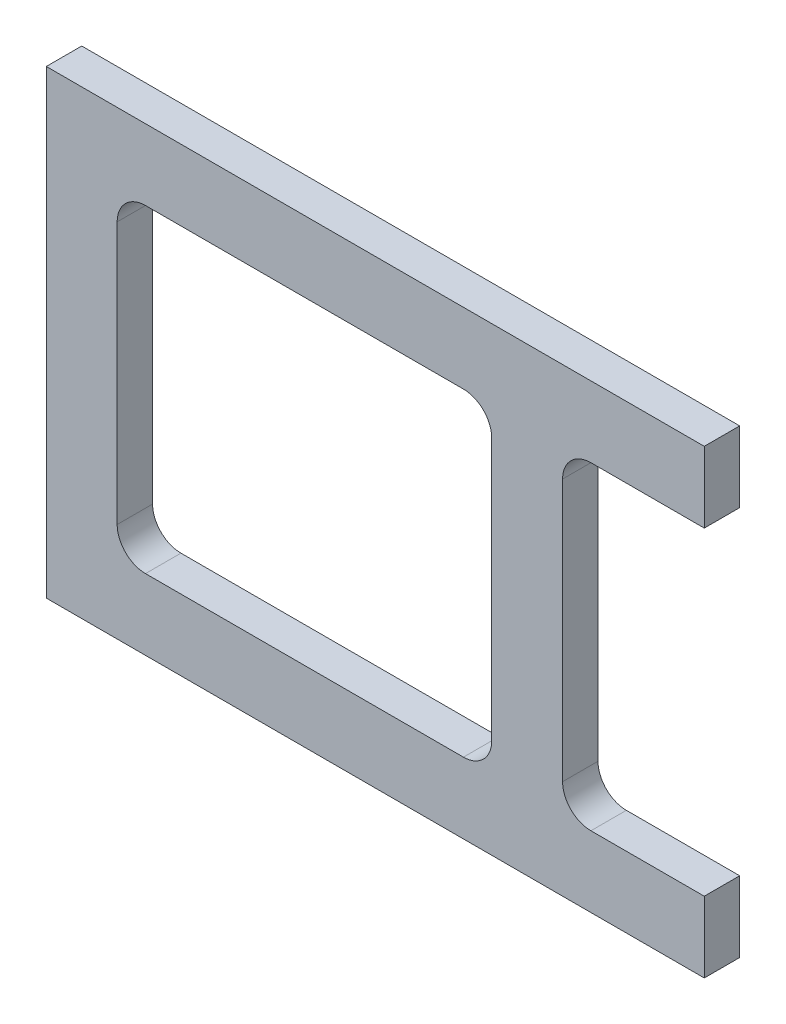
ISO-10303-21;
HEADER;
FILE_DESCRIPTION(('STEP AP214'),'2;1');
FILE_NAME('part.step','',(''),(''),'','','');
FILE_SCHEMA(('AUTOMOTIVE_DESIGN { 1 0 10303 214 1 1 1 1 }'));
ENDSEC;
DATA;
#1=APPLICATION_CONTEXT('core data for automotive mechanical design processes');
#2=APPLICATION_PROTOCOL_DEFINITION('international standard','automotive_design',2000,#1);
#3=PRODUCT_CONTEXT('',#1,'mechanical');
#4=PRODUCT('Part','Part','',(#3));
#5=PRODUCT_RELATED_PRODUCT_CATEGORY('part','',(#4));
#6=PRODUCT_DEFINITION_FORMATION('','',#4);
#7=PRODUCT_DEFINITION_CONTEXT('part definition',#1,'design');
#8=PRODUCT_DEFINITION('design','',#6,#7);
#9=PRODUCT_DEFINITION_SHAPE('','',#8);
#10=(LENGTH_UNIT() NAMED_UNIT(*) SI_UNIT(.MILLI.,.METRE.));
#11=(NAMED_UNIT(*) PLANE_ANGLE_UNIT() SI_UNIT($,.RADIAN.));
#12=(NAMED_UNIT(*) SI_UNIT($,.STERADIAN.) SOLID_ANGLE_UNIT());
#13=UNCERTAINTY_MEASURE_WITH_UNIT(LENGTH_MEASURE(1.E-05),#10,'distance_accuracy_value','');
#14=(GEOMETRIC_REPRESENTATION_CONTEXT(3) GLOBAL_UNCERTAINTY_ASSIGNED_CONTEXT((#13)) GLOBAL_UNIT_ASSIGNED_CONTEXT((#10,
#11,#12)) REPRESENTATION_CONTEXT('',''));
#15=CARTESIAN_POINT('',(0.,0.,0.));
#16=DIRECTION('',(0.,0.,1.));
#17=DIRECTION('',(1.,0.,0.));
#18=AXIS2_PLACEMENT_3D('',#15,#16,#17);
#19=CARTESIAN_POINT('',(29.4894,-20.6375,3.175));
#20=DIRECTION('',(-1.,0.,0.));
#21=DIRECTION('',(0.,0.,1.));
#22=AXIS2_PLACEMENT_3D('',#19,#20,#21);
#23=PLANE('',#22);
#24=DIRECTION('',(0.,1.,0.));
#25=VECTOR('',#24,1.);
#26=CARTESIAN_POINT('',(29.4894,-20.6375,0.));
#27=LINE('',#26,#25);
#28=CARTESIAN_POINT('',(29.4894,-20.6375,0.));
#29=VERTEX_POINT('',#28);
#30=CARTESIAN_POINT('',(29.4894,-14.2875,0.));
#31=VERTEX_POINT('',#30);
#32=EDGE_CURVE('E178',#29,#31,#27,.T.);
#33=ORIENTED_EDGE('',*,*,#32,.T.);
#34=DIRECTION('',(0.,0.,1.));
#35=VECTOR('',#34,1.);
#36=CARTESIAN_POINT('',(29.4894,-14.2875,0.));
#37=LINE('',#36,#35);
#38=CARTESIAN_POINT('',(29.4894,-14.2875,3.175));
#39=VERTEX_POINT('',#38);
#40=EDGE_CURVE('E170',#31,#39,#37,.T.);
#41=ORIENTED_EDGE('',*,*,#40,.T.);
#42=DIRECTION('',(0.,1.,0.));
#43=VECTOR('',#42,1.);
#44=CARTESIAN_POINT('',(29.4894,-20.6375,3.175));
#45=LINE('',#44,#43);
#46=CARTESIAN_POINT('',(29.4894,-20.6375,3.175));
#47=VERTEX_POINT('',#46);
#48=EDGE_CURVE('E277',#47,#39,#45,.T.);
#49=ORIENTED_EDGE('',*,*,#48,.F.);
#50=DIRECTION('',(0.,0.,-1.));
#51=VECTOR('',#50,1.);
#52=CARTESIAN_POINT('',(29.4894,-20.6375,3.175));
#53=LINE('',#52,#51);
#54=EDGE_CURVE('E192',#47,#29,#53,.T.);
#55=ORIENTED_EDGE('',*,*,#54,.T.);
#56=EDGE_LOOP('',(#33,#41,#49,#55));
#57=FACE_BOUND('',#56,.T.);
#58=ADVANCED_FACE('F32',(#57),#23,.F.);
#59=CARTESIAN_POINT('',(29.4894,14.2875,3.175));
#60=VERTEX_POINT('',#59);
#61=CARTESIAN_POINT('',(29.4894,20.6375,3.175));
#62=VERTEX_POINT('',#61);
#63=EDGE_CURVE('E169',#60,#62,#45,.T.);
#64=ORIENTED_EDGE('',*,*,#63,.F.);
#65=DIRECTION('',(0.,0.,1.));
#66=VECTOR('',#65,1.);
#67=CARTESIAN_POINT('',(29.4894,14.2875,0.));
#68=LINE('',#67,#66);
#69=CARTESIAN_POINT('',(29.4894,14.2875,0.));
#70=VERTEX_POINT('',#69);
#71=EDGE_CURVE('E156',#70,#60,#68,.T.);
#72=ORIENTED_EDGE('',*,*,#71,.F.);
#73=CARTESIAN_POINT('',(29.4894,20.6375,0.));
#74=VERTEX_POINT('',#73);
#75=EDGE_CURVE('E167',#70,#74,#27,.T.);
#76=ORIENTED_EDGE('',*,*,#75,.T.);
#77=DIRECTION('',(0.,0.,-1.));
#78=VECTOR('',#77,1.);
#79=CARTESIAN_POINT('',(29.4894,20.6375,3.175));
#80=LINE('',#79,#78);
#81=EDGE_CURVE('E201',#62,#74,#80,.T.);
#82=ORIENTED_EDGE('',*,*,#81,.F.);
#83=EDGE_LOOP('',(#64,#72,#76,#82));
#84=FACE_BOUND('',#83,.T.);
#85=ADVANCED_FACE('F165',(#84),#23,.F.);
#86=CARTESIAN_POINT('',(-29.4894,20.6375,3.175));
#87=DIRECTION('',(0.,-1.,0.));
#88=DIRECTION('',(0.,0.,-1.));
#89=AXIS2_PLACEMENT_3D('',#86,#87,#88);
#90=PLANE('',#89);
#91=DIRECTION('',(-1.,0.,0.));
#92=VECTOR('',#91,1.);
#93=CARTESIAN_POINT('',(-29.4894,20.6375,0.));
#94=LINE('',#93,#92);
#95=CARTESIAN_POINT('',(-29.4894,20.6375,0.));
#96=VERTEX_POINT('',#95);
#97=EDGE_CURVE('E176',#74,#96,#94,.T.);
#98=ORIENTED_EDGE('',*,*,#97,.T.);
#99=DIRECTION('',(0.,0.,-1.));
#100=VECTOR('',#99,1.);
#101=CARTESIAN_POINT('',(-29.4894,20.6375,3.175));
#102=LINE('',#101,#100);
#103=CARTESIAN_POINT('',(-29.4894,20.6375,3.175));
#104=VERTEX_POINT('',#103);
#105=EDGE_CURVE('E198',#104,#96,#102,.T.);
#106=ORIENTED_EDGE('',*,*,#105,.F.);
#107=DIRECTION('',(-1.,0.,0.));
#108=VECTOR('',#107,1.);
#109=CARTESIAN_POINT('',(-29.4894,20.6375,3.175));
#110=LINE('',#109,#108);
#111=EDGE_CURVE('E279',#62,#104,#110,.T.);
#112=ORIENTED_EDGE('',*,*,#111,.F.);
#113=ORIENTED_EDGE('',*,*,#81,.T.);
#114=EDGE_LOOP('',(#98,#106,#112,#113));
#115=FACE_BOUND('',#114,.T.);
#116=ADVANCED_FACE('F295',(#115),#90,.F.);
#117=CARTESIAN_POINT('',(-29.4894,-20.6375,3.175));
#118=DIRECTION('',(1.,0.,0.));
#119=DIRECTION('',(0.,0.,-1.));
#120=AXIS2_PLACEMENT_3D('',#117,#118,#119);
#121=PLANE('',#120);
#122=DIRECTION('',(0.,-1.,0.));
#123=VECTOR('',#122,1.);
#124=CARTESIAN_POINT('',(-29.4894,-20.6375,0.));
#125=LINE('',#124,#123);
#126=CARTESIAN_POINT('',(-29.4894,-20.6375,0.));
#127=VERTEX_POINT('',#126);
#128=EDGE_CURVE('E188',#96,#127,#125,.T.);
#129=ORIENTED_EDGE('',*,*,#128,.T.);
#130=DIRECTION('',(0.,0.,-1.));
#131=VECTOR('',#130,1.);
#132=CARTESIAN_POINT('',(-29.4894,-20.6375,3.175));
#133=LINE('',#132,#131);
#134=CARTESIAN_POINT('',(-29.4894,-20.6375,3.175));
#135=VERTEX_POINT('',#134);
#136=EDGE_CURVE('E195',#135,#127,#133,.T.);
#137=ORIENTED_EDGE('',*,*,#136,.F.);
#138=DIRECTION('',(0.,-1.,0.));
#139=VECTOR('',#138,1.);
#140=CARTESIAN_POINT('',(-29.4894,-20.6375,3.175));
#141=LINE('',#140,#139);
#142=EDGE_CURVE('E280',#104,#135,#141,.T.);
#143=ORIENTED_EDGE('',*,*,#142,.F.);
#144=ORIENTED_EDGE('',*,*,#105,.T.);
#145=EDGE_LOOP('',(#129,#137,#143,#144));
#146=FACE_BOUND('',#145,.T.);
#147=ADVANCED_FACE('F291',(#146),#121,.F.);
#148=CARTESIAN_POINT('',(-29.4894,-20.6375,3.175));
#149=DIRECTION('',(0.,1.,0.));
#150=DIRECTION('',(0.,0.,1.));
#151=AXIS2_PLACEMENT_3D('',#148,#149,#150);
#152=PLANE('',#151);
#153=DIRECTION('',(1.,0.,0.));
#154=VECTOR('',#153,1.);
#155=CARTESIAN_POINT('',(-29.4894,-20.6375,0.));
#156=LINE('',#155,#154);
#157=EDGE_CURVE('E190',#127,#29,#156,.T.);
#158=ORIENTED_EDGE('',*,*,#157,.T.);
#159=ORIENTED_EDGE('',*,*,#54,.F.);
#160=DIRECTION('',(1.,0.,0.));
#161=VECTOR('',#160,1.);
#162=CARTESIAN_POINT('',(-29.4894,-20.6375,3.175));
#163=LINE('',#162,#161);
#164=EDGE_CURVE('E185',#135,#47,#163,.T.);
#165=ORIENTED_EDGE('',*,*,#164,.F.);
#166=ORIENTED_EDGE('',*,*,#136,.T.);
#167=EDGE_LOOP('',(#158,#159,#165,#166));
#168=FACE_BOUND('',#167,.T.);
#169=ADVANCED_FACE('F287',(#168),#152,.F.);
#170=CARTESIAN_POINT('',(0.,0.,3.175));
#171=DIRECTION('',(0.,0.,-1.));
#172=DIRECTION('',(-1.,0.,0.));
#173=AXIS2_PLACEMENT_3D('',#170,#171,#172);
#174=PLANE('',#173);
#175=DIRECTION('',(-1.,0.,0.));
#176=VECTOR('',#175,1.);
#177=CARTESIAN_POINT('',(10.4394,14.2875,3.175));
#178=LINE('',#177,#176);
#179=CARTESIAN_POINT('',(7.89940000000001,14.2875,3.175));
#180=VERTEX_POINT('',#179);
#181=CARTESIAN_POINT('',(-20.5994,14.2875,3.175));
#182=VERTEX_POINT('',#181);
#183=EDGE_CURVE('E306',#180,#182,#178,.T.);
#184=ORIENTED_EDGE('',*,*,#183,.F.);
#185=CARTESIAN_POINT('',(7.89940000000001,11.7475,3.175));
#186=DIRECTION('',(0.,0.,-1.));
#187=DIRECTION('',(-1.,0.,0.));
#188=AXIS2_PLACEMENT_3D('',#185,#186,#187);
#189=CIRCLE('',#188,2.54);
#190=CARTESIAN_POINT('',(10.4394,11.7475,3.175));
#191=VERTEX_POINT('',#190);
#192=EDGE_CURVE('E232',#180,#191,#189,.T.);
#193=ORIENTED_EDGE('',*,*,#192,.T.);
#194=DIRECTION('',(0.,1.,0.));
#195=VECTOR('',#194,1.);
#196=CARTESIAN_POINT('',(10.4394,14.2875,3.175));
#197=LINE('',#196,#195);
#198=CARTESIAN_POINT('',(10.4394,-11.7475,3.175));
#199=VERTEX_POINT('',#198);
#200=EDGE_CURVE('E309',#199,#191,#197,.T.);
#201=ORIENTED_EDGE('',*,*,#200,.F.);
#202=CARTESIAN_POINT('',(7.89940000000001,-11.7475,3.175));
#203=DIRECTION('',(0.,0.,-1.));
#204=DIRECTION('',(-1.,0.,0.));
#205=AXIS2_PLACEMENT_3D('',#202,#203,#204);
#206=CIRCLE('',#205,2.54);
#207=CARTESIAN_POINT('',(7.89940000000001,-14.2875,3.175));
#208=VERTEX_POINT('',#207);
#209=EDGE_CURVE('E236',#199,#208,#206,.T.);
#210=ORIENTED_EDGE('',*,*,#209,.T.);
#211=DIRECTION('',(1.,0.,0.));
#212=VECTOR('',#211,1.);
#213=CARTESIAN_POINT('',(10.4394,-14.2875,3.175));
#214=LINE('',#213,#212);
#215=CARTESIAN_POINT('',(-20.5994,-14.2875,3.175));
#216=VERTEX_POINT('',#215);
#217=EDGE_CURVE('E299',#216,#208,#214,.T.);
#218=ORIENTED_EDGE('',*,*,#217,.F.);
#219=CARTESIAN_POINT('',(-20.5994,-11.7475,3.175));
#220=DIRECTION('',(0.,0.,-1.));
#221=DIRECTION('',(-1.,0.,0.));
#222=AXIS2_PLACEMENT_3D('',#219,#220,#221);
#223=CIRCLE('',#222,2.54);
#224=CARTESIAN_POINT('',(-23.1394,-11.7475,3.175));
#225=VERTEX_POINT('',#224);
#226=EDGE_CURVE('E240',#216,#225,#223,.T.);
#227=ORIENTED_EDGE('',*,*,#226,.T.);
#228=DIRECTION('',(0.,-1.,0.));
#229=VECTOR('',#228,1.);
#230=CARTESIAN_POINT('',(-23.1394,14.2875,3.175));
#231=LINE('',#230,#229);
#232=CARTESIAN_POINT('',(-23.1394,11.7475,3.175));
#233=VERTEX_POINT('',#232);
#234=EDGE_CURVE('E303',#233,#225,#231,.T.);
#235=ORIENTED_EDGE('',*,*,#234,.F.);
#236=CARTESIAN_POINT('',(-20.5994,11.7475,3.175));
#237=DIRECTION('',(0.,0.,-1.));
#238=DIRECTION('',(-1.,0.,0.));
#239=AXIS2_PLACEMENT_3D('',#236,#237,#238);
#240=CIRCLE('',#239,2.54);
#241=EDGE_CURVE('E244',#233,#182,#240,.T.);
#242=ORIENTED_EDGE('',*,*,#241,.T.);
#243=EDGE_LOOP('',(#184,#193,#201,#210,#218,#227,#235,#242));
#244=FACE_BOUND('',#243,.T.);
#245=ORIENTED_EDGE('',*,*,#48,.T.);
#246=DIRECTION('',(1.,0.,0.));
#247=VECTOR('',#246,1.);
#248=CARTESIAN_POINT('',(29.4894,-14.2875,3.175));
#249=LINE('',#248,#247);
#250=CARTESIAN_POINT('',(19.3294,-14.2875,3.175));
#251=VERTEX_POINT('',#250);
#252=EDGE_CURVE('E161',#251,#39,#249,.T.);
#253=ORIENTED_EDGE('',*,*,#252,.F.);
#254=CARTESIAN_POINT('',(19.3294,-11.7475,3.175));
#255=DIRECTION('',(0.,0.,-1.));
#256=DIRECTION('',(-1.,0.,0.));
#257=AXIS2_PLACEMENT_3D('',#254,#255,#256);
#258=CIRCLE('',#257,2.54);
#259=CARTESIAN_POINT('',(16.7894,-11.7475,3.175));
#260=VERTEX_POINT('',#259);
#261=EDGE_CURVE('E248',#251,#260,#258,.T.);
#262=ORIENTED_EDGE('',*,*,#261,.T.);
#263=DIRECTION('',(0.,-1.,0.));
#264=VECTOR('',#263,1.);
#265=CARTESIAN_POINT('',(16.7894,14.2875,3.175));
#266=LINE('',#265,#264);
#267=CARTESIAN_POINT('',(16.7894,11.7475,3.175));
#268=VERTEX_POINT('',#267);
#269=EDGE_CURVE('E267',#268,#260,#266,.T.);
#270=ORIENTED_EDGE('',*,*,#269,.F.);
#271=CARTESIAN_POINT('',(19.3294,11.7475,3.175));
#272=DIRECTION('',(0.,0.,-1.));
#273=DIRECTION('',(-1.,0.,0.));
#274=AXIS2_PLACEMENT_3D('',#271,#272,#273);
#275=CIRCLE('',#274,2.54);
#276=CARTESIAN_POINT('',(19.3294,14.2875,3.175));
#277=VERTEX_POINT('',#276);
#278=EDGE_CURVE('E40',#268,#277,#275,.T.);
#279=ORIENTED_EDGE('',*,*,#278,.T.);
#280=DIRECTION('',(-1.,0.,0.));
#281=VECTOR('',#280,1.);
#282=CARTESIAN_POINT('',(29.4894,14.2875,3.175));
#283=LINE('',#282,#281);
#284=EDGE_CURVE('E271',#60,#277,#283,.T.);
#285=ORIENTED_EDGE('',*,*,#284,.F.);
#286=ORIENTED_EDGE('',*,*,#63,.T.);
#287=ORIENTED_EDGE('',*,*,#111,.T.);
#288=ORIENTED_EDGE('',*,*,#142,.T.);
#289=ORIENTED_EDGE('',*,*,#164,.T.);
#290=EDGE_LOOP('',(#245,#253,#262,#270,#279,#285,#286,#287,#288,#289));
#291=FACE_BOUND('',#290,.T.);
#292=ADVANCED_FACE('F266',(#244,#291),#174,.F.);
#293=CARTESIAN_POINT('',(0.,0.,0.));
#294=DIRECTION('',(0.,0.,-1.));
#295=DIRECTION('',(-1.,0.,0.));
#296=AXIS2_PLACEMENT_3D('',#293,#294,#295);
#297=PLANE('',#296);
#298=DIRECTION('',(1.,0.,0.));
#299=VECTOR('',#298,1.);
#300=CARTESIAN_POINT('',(10.4394,-14.2875,0.));
#301=LINE('',#300,#299);
#302=CARTESIAN_POINT('',(-20.5994,-14.2875,0.));
#303=VERTEX_POINT('',#302);
#304=CARTESIAN_POINT('',(7.89940000000001,-14.2875,0.));
#305=VERTEX_POINT('',#304);
#306=EDGE_CURVE('E274',#303,#305,#301,.T.);
#307=ORIENTED_EDGE('',*,*,#306,.T.);
#308=CARTESIAN_POINT('',(7.89940000000001,-11.7475,0.));
#309=DIRECTION('',(0.,0.,-1.));
#310=DIRECTION('',(-1.,0.,0.));
#311=AXIS2_PLACEMENT_3D('',#308,#309,#310);
#312=CIRCLE('',#311,2.54);
#313=CARTESIAN_POINT('',(10.4394,-11.7475,0.));
#314=VERTEX_POINT('',#313);
#315=EDGE_CURVE('E238',#305,#314,#312,.F.);
#316=ORIENTED_EDGE('',*,*,#315,.T.);
#317=DIRECTION('',(0.,1.,0.));
#318=VECTOR('',#317,1.);
#319=CARTESIAN_POINT('',(10.4394,14.2875,0.));
#320=LINE('',#319,#318);
#321=CARTESIAN_POINT('',(10.4394,11.7475,0.));
#322=VERTEX_POINT('',#321);
#323=EDGE_CURVE('E302',#314,#322,#320,.T.);
#324=ORIENTED_EDGE('',*,*,#323,.T.);
#325=CARTESIAN_POINT('',(7.89940000000001,11.7475,0.));
#326=DIRECTION('',(0.,0.,-1.));
#327=DIRECTION('',(-1.,0.,0.));
#328=AXIS2_PLACEMENT_3D('',#325,#326,#327);
#329=CIRCLE('',#328,2.54);
#330=CARTESIAN_POINT('',(7.89940000000001,14.2875,0.));
#331=VERTEX_POINT('',#330);
#332=EDGE_CURVE('E234',#322,#331,#329,.F.);
#333=ORIENTED_EDGE('',*,*,#332,.T.);
#334=DIRECTION('',(-1.,0.,0.));
#335=VECTOR('',#334,1.);
#336=CARTESIAN_POINT('',(10.4394,14.2875,0.));
#337=LINE('',#336,#335);
#338=CARTESIAN_POINT('',(-20.5994,14.2875,0.));
#339=VERTEX_POINT('',#338);
#340=EDGE_CURVE('E317',#331,#339,#337,.T.);
#341=ORIENTED_EDGE('',*,*,#340,.T.);
#342=CARTESIAN_POINT('',(-20.5994,11.7475,0.));
#343=DIRECTION('',(0.,0.,-1.));
#344=DIRECTION('',(-1.,0.,0.));
#345=AXIS2_PLACEMENT_3D('',#342,#343,#344);
#346=CIRCLE('',#345,2.54);
#347=CARTESIAN_POINT('',(-23.1394,11.7475,0.));
#348=VERTEX_POINT('',#347);
#349=EDGE_CURVE('E246',#339,#348,#346,.F.);
#350=ORIENTED_EDGE('',*,*,#349,.T.);
#351=DIRECTION('',(0.,-1.,0.));
#352=VECTOR('',#351,1.);
#353=CARTESIAN_POINT('',(-23.1394,14.2875,0.));
#354=LINE('',#353,#352);
#355=CARTESIAN_POINT('',(-23.1394,-11.7475,0.));
#356=VERTEX_POINT('',#355);
#357=EDGE_CURVE('E314',#348,#356,#354,.T.);
#358=ORIENTED_EDGE('',*,*,#357,.T.);
#359=CARTESIAN_POINT('',(-20.5994,-11.7475,0.));
#360=DIRECTION('',(0.,0.,-1.));
#361=DIRECTION('',(-1.,0.,0.));
#362=AXIS2_PLACEMENT_3D('',#359,#360,#361);
#363=CIRCLE('',#362,2.54);
#364=EDGE_CURVE('E242',#356,#303,#363,.F.);
#365=ORIENTED_EDGE('',*,*,#364,.T.);
#366=EDGE_LOOP('',(#307,#316,#324,#333,#341,#350,#358,#365));
#367=FACE_BOUND('',#366,.T.);
#368=DIRECTION('',(0.,-1.,0.));
#369=VECTOR('',#368,1.);
#370=CARTESIAN_POINT('',(16.7894,14.2875,0.));
#371=LINE('',#370,#369);
#372=CARTESIAN_POINT('',(16.7894,11.7475,0.));
#373=VERTEX_POINT('',#372);
#374=CARTESIAN_POINT('',(16.7894,-11.7475,0.));
#375=VERTEX_POINT('',#374);
#376=EDGE_CURVE('E160',#373,#375,#371,.T.);
#377=ORIENTED_EDGE('',*,*,#376,.T.);
#378=CARTESIAN_POINT('',(19.3294,-11.7475,0.));
#379=DIRECTION('',(0.,0.,-1.));
#380=DIRECTION('',(-1.,0.,0.));
#381=AXIS2_PLACEMENT_3D('',#378,#379,#380);
#382=CIRCLE('',#381,2.54);
#383=CARTESIAN_POINT('',(19.3294,-14.2875,0.));
#384=VERTEX_POINT('',#383);
#385=EDGE_CURVE('E250',#375,#384,#382,.F.);
#386=ORIENTED_EDGE('',*,*,#385,.T.);
#387=DIRECTION('',(1.,0.,0.));
#388=VECTOR('',#387,1.);
#389=CARTESIAN_POINT('',(29.4894,-14.2875,0.));
#390=LINE('',#389,#388);
#391=EDGE_CURVE('E171',#384,#31,#390,.T.);
#392=ORIENTED_EDGE('',*,*,#391,.T.);
#393=ORIENTED_EDGE('',*,*,#32,.F.);
#394=ORIENTED_EDGE('',*,*,#157,.F.);
#395=ORIENTED_EDGE('',*,*,#128,.F.);
#396=ORIENTED_EDGE('',*,*,#97,.F.);
#397=ORIENTED_EDGE('',*,*,#75,.F.);
#398=DIRECTION('',(-1.,0.,0.));
#399=VECTOR('',#398,1.);
#400=CARTESIAN_POINT('',(29.4894,14.2875,0.));
#401=LINE('',#400,#399);
#402=CARTESIAN_POINT('',(19.3294,14.2875,0.));
#403=VERTEX_POINT('',#402);
#404=EDGE_CURVE('E153',#70,#403,#401,.T.);
#405=ORIENTED_EDGE('',*,*,#404,.T.);
#406=CARTESIAN_POINT('',(19.3294,11.7475,0.));
#407=DIRECTION('',(0.,0.,-1.));
#408=DIRECTION('',(-1.,0.,0.));
#409=AXIS2_PLACEMENT_3D('',#406,#407,#408);
#410=CIRCLE('',#409,2.54);
#411=EDGE_CURVE('E11',#403,#373,#410,.F.);
#412=ORIENTED_EDGE('',*,*,#411,.T.);
#413=EDGE_LOOP('',(#377,#386,#392,#393,#394,#395,#396,#397,#405,#412));
#414=FACE_BOUND('',#413,.T.);
#415=ADVANCED_FACE('F174',(#367,#414),#297,.T.);
#416=CARTESIAN_POINT('',(29.4894,-14.2875,0.));
#417=DIRECTION('',(0.,-1.,0.));
#418=DIRECTION('',(1.,0.,0.));
#419=AXIS2_PLACEMENT_3D('',#416,#417,#418);
#420=PLANE('',#419);
#421=ORIENTED_EDGE('',*,*,#391,.F.);
#422=DIRECTION('',(0.,0.,1.));
#423=VECTOR('',#422,1.);
#424=CARTESIAN_POINT('',(19.3294,-14.2875,3.175));
#425=LINE('',#424,#423);
#426=EDGE_CURVE('E223',#384,#251,#425,.T.);
#427=ORIENTED_EDGE('',*,*,#426,.T.);
#428=ORIENTED_EDGE('',*,*,#252,.T.);
#429=ORIENTED_EDGE('',*,*,#40,.F.);
#430=EDGE_LOOP('',(#421,#427,#428,#429));
#431=FACE_BOUND('',#430,.T.);
#432=ADVANCED_FACE('F260',(#431),#420,.F.);
#433=CARTESIAN_POINT('',(16.7894,14.2875,0.));
#434=DIRECTION('',(-1.,0.,0.));
#435=DIRECTION('',(0.,-1.,0.));
#436=AXIS2_PLACEMENT_3D('',#433,#434,#435);
#437=PLANE('',#436);
#438=ORIENTED_EDGE('',*,*,#269,.T.);
#439=DIRECTION('',(0.,0.,1.));
#440=VECTOR('',#439,1.);
#441=CARTESIAN_POINT('',(16.7894,-11.7475,0.));
#442=LINE('',#441,#440);
#443=EDGE_CURVE('E229',#260,#375,#442,.F.);
#444=ORIENTED_EDGE('',*,*,#443,.T.);
#445=ORIENTED_EDGE('',*,*,#376,.F.);
#446=DIRECTION('',(0.,0.,1.));
#447=VECTOR('',#446,1.);
#448=CARTESIAN_POINT('',(16.7894,11.7475,3.175));
#449=LINE('',#448,#447);
#450=EDGE_CURVE('E226',#373,#268,#449,.T.);
#451=ORIENTED_EDGE('',*,*,#450,.T.);
#452=EDGE_LOOP('',(#438,#444,#445,#451));
#453=FACE_BOUND('',#452,.T.);
#454=ADVANCED_FACE('F269',(#453),#437,.F.);
#455=CARTESIAN_POINT('',(29.4894,14.2875,0.));
#456=DIRECTION('',(0.,1.,0.));
#457=DIRECTION('',(-1.,0.,0.));
#458=AXIS2_PLACEMENT_3D('',#455,#456,#457);
#459=PLANE('',#458);
#460=ORIENTED_EDGE('',*,*,#284,.T.);
#461=DIRECTION('',(0.,0.,1.));
#462=VECTOR('',#461,1.);
#463=CARTESIAN_POINT('',(19.3294,14.2875,0.));
#464=LINE('',#463,#462);
#465=EDGE_CURVE('E47',#277,#403,#464,.F.);
#466=ORIENTED_EDGE('',*,*,#465,.T.);
#467=ORIENTED_EDGE('',*,*,#404,.F.);
#468=ORIENTED_EDGE('',*,*,#71,.T.);
#469=EDGE_LOOP('',(#460,#466,#467,#468));
#470=FACE_BOUND('',#469,.T.);
#471=ADVANCED_FACE('F155',(#470),#459,.F.);
#472=CARTESIAN_POINT('',(10.4394,14.2875,0.));
#473=DIRECTION('',(1.,0.,0.));
#474=DIRECTION('',(0.,1.,0.));
#475=AXIS2_PLACEMENT_3D('',#472,#473,#474);
#476=PLANE('',#475);
#477=ORIENTED_EDGE('',*,*,#200,.T.);
#478=DIRECTION('',(0.,0.,1.));
#479=VECTOR('',#478,1.);
#480=CARTESIAN_POINT('',(10.4394,11.7475,0.));
#481=LINE('',#480,#479);
#482=EDGE_CURVE('E211',#191,#322,#481,.F.);
#483=ORIENTED_EDGE('',*,*,#482,.T.);
#484=ORIENTED_EDGE('',*,*,#323,.F.);
#485=DIRECTION('',(0.,0.,1.));
#486=VECTOR('',#485,1.);
#487=CARTESIAN_POINT('',(10.4394,-11.7475,3.175));
#488=LINE('',#487,#486);
#489=EDGE_CURVE('E208',#314,#199,#488,.T.);
#490=ORIENTED_EDGE('',*,*,#489,.T.);
#491=EDGE_LOOP('',(#477,#483,#484,#490));
#492=FACE_BOUND('',#491,.T.);
#493=ADVANCED_FACE('F358',(#492),#476,.F.);
#494=CARTESIAN_POINT('',(10.4394,-14.2875,0.));
#495=DIRECTION('',(0.,-1.,0.));
#496=DIRECTION('',(1.,0.,0.));
#497=AXIS2_PLACEMENT_3D('',#494,#495,#496);
#498=PLANE('',#497);
#499=ORIENTED_EDGE('',*,*,#217,.T.);
#500=DIRECTION('',(0.,0.,1.));
#501=VECTOR('',#500,1.);
#502=CARTESIAN_POINT('',(7.89940000000001,-14.2875,0.));
#503=LINE('',#502,#501);
#504=EDGE_CURVE('E216',#208,#305,#503,.F.);
#505=ORIENTED_EDGE('',*,*,#504,.T.);
#506=ORIENTED_EDGE('',*,*,#306,.F.);
#507=DIRECTION('',(0.,0.,1.));
#508=VECTOR('',#507,1.);
#509=CARTESIAN_POINT('',(-20.5994,-14.2875,3.175));
#510=LINE('',#509,#508);
#511=EDGE_CURVE('E213',#303,#216,#510,.T.);
#512=ORIENTED_EDGE('',*,*,#511,.T.);
#513=EDGE_LOOP('',(#499,#505,#506,#512));
#514=FACE_BOUND('',#513,.T.);
#515=ADVANCED_FACE('F354',(#514),#498,.F.);
#516=CARTESIAN_POINT('',(-23.1394,14.2875,0.));
#517=DIRECTION('',(-1.,0.,0.));
#518=DIRECTION('',(0.,-1.,0.));
#519=AXIS2_PLACEMENT_3D('',#516,#517,#518);
#520=PLANE('',#519);
#521=ORIENTED_EDGE('',*,*,#234,.T.);
#522=DIRECTION('',(0.,0.,1.));
#523=VECTOR('',#522,1.);
#524=CARTESIAN_POINT('',(-23.1394,-11.7475,0.));
#525=LINE('',#524,#523);
#526=EDGE_CURVE('E221',#225,#356,#525,.F.);
#527=ORIENTED_EDGE('',*,*,#526,.T.);
#528=ORIENTED_EDGE('',*,*,#357,.F.);
#529=DIRECTION('',(0.,0.,1.));
#530=VECTOR('',#529,1.);
#531=CARTESIAN_POINT('',(-23.1394,11.7475,3.175));
#532=LINE('',#531,#530);
#533=EDGE_CURVE('E218',#348,#233,#532,.T.);
#534=ORIENTED_EDGE('',*,*,#533,.T.);
#535=EDGE_LOOP('',(#521,#527,#528,#534));
#536=FACE_BOUND('',#535,.T.);
#537=ADVANCED_FACE('F345',(#536),#520,.F.);
#538=CARTESIAN_POINT('',(10.4394,14.2875,0.));
#539=DIRECTION('',(0.,1.,0.));
#540=DIRECTION('',(-1.,0.,0.));
#541=AXIS2_PLACEMENT_3D('',#538,#539,#540);
#542=PLANE('',#541);
#543=ORIENTED_EDGE('',*,*,#340,.F.);
#544=DIRECTION('',(0.,0.,1.));
#545=VECTOR('',#544,1.);
#546=CARTESIAN_POINT('',(7.89940000000001,14.2875,3.175));
#547=LINE('',#546,#545);
#548=EDGE_CURVE('E205',#331,#180,#547,.T.);
#549=ORIENTED_EDGE('',*,*,#548,.T.);
#550=ORIENTED_EDGE('',*,*,#183,.T.);
#551=DIRECTION('',(0.,0.,1.));
#552=VECTOR('',#551,1.);
#553=CARTESIAN_POINT('',(-20.5994,14.2875,0.));
#554=LINE('',#553,#552);
#555=EDGE_CURVE('E203',#182,#339,#554,.F.);
#556=ORIENTED_EDGE('',*,*,#555,.T.);
#557=EDGE_LOOP('',(#543,#549,#550,#556));
#558=FACE_BOUND('',#557,.T.);
#559=ADVANCED_FACE('F334',(#558),#542,.F.);
#560=CARTESIAN_POINT('',(7.89940000000001,11.7475,0.));
#561=DIRECTION('',(0.,0.,-1.));
#562=DIRECTION('',(-1.,0.,0.));
#563=AXIS2_PLACEMENT_3D('',#560,#561,#562);
#564=CYLINDRICAL_SURFACE('',#563,2.54);
#565=ORIENTED_EDGE('',*,*,#332,.F.);
#566=ORIENTED_EDGE('',*,*,#482,.F.);
#567=ORIENTED_EDGE('',*,*,#192,.F.);
#568=ORIENTED_EDGE('',*,*,#548,.F.);
#569=EDGE_LOOP('',(#565,#566,#567,#568));
#570=FACE_BOUND('',#569,.T.);
#571=ADVANCED_FACE('F331',(#570),#564,.F.);
#572=CARTESIAN_POINT('',(7.89940000000001,-11.7475,0.));
#573=DIRECTION('',(0.,0.,-1.));
#574=DIRECTION('',(-1.,0.,0.));
#575=AXIS2_PLACEMENT_3D('',#572,#573,#574);
#576=CYLINDRICAL_SURFACE('',#575,2.54);
#577=ORIENTED_EDGE('',*,*,#315,.F.);
#578=ORIENTED_EDGE('',*,*,#504,.F.);
#579=ORIENTED_EDGE('',*,*,#209,.F.);
#580=ORIENTED_EDGE('',*,*,#489,.F.);
#581=EDGE_LOOP('',(#577,#578,#579,#580));
#582=FACE_BOUND('',#581,.T.);
#583=ADVANCED_FACE('F357',(#582),#576,.F.);
#584=CARTESIAN_POINT('',(-20.5994,-11.7475,0.));
#585=DIRECTION('',(0.,0.,-1.));
#586=DIRECTION('',(-1.,0.,0.));
#587=AXIS2_PLACEMENT_3D('',#584,#585,#586);
#588=CYLINDRICAL_SURFACE('',#587,2.54);
#589=ORIENTED_EDGE('',*,*,#364,.F.);
#590=ORIENTED_EDGE('',*,*,#526,.F.);
#591=ORIENTED_EDGE('',*,*,#226,.F.);
#592=ORIENTED_EDGE('',*,*,#511,.F.);
#593=EDGE_LOOP('',(#589,#590,#591,#592));
#594=FACE_BOUND('',#593,.T.);
#595=ADVANCED_FACE('F351',(#594),#588,.F.);
#596=CARTESIAN_POINT('',(-20.5994,11.7475,0.));
#597=DIRECTION('',(0.,0.,-1.));
#598=DIRECTION('',(-1.,0.,0.));
#599=AXIS2_PLACEMENT_3D('',#596,#597,#598);
#600=CYLINDRICAL_SURFACE('',#599,2.54);
#601=ORIENTED_EDGE('',*,*,#349,.F.);
#602=ORIENTED_EDGE('',*,*,#555,.F.);
#603=ORIENTED_EDGE('',*,*,#241,.F.);
#604=ORIENTED_EDGE('',*,*,#533,.F.);
#605=EDGE_LOOP('',(#601,#602,#603,#604));
#606=FACE_BOUND('',#605,.T.);
#607=ADVANCED_FACE('F342',(#606),#600,.F.);
#608=CARTESIAN_POINT('',(19.3294,-11.7475,0.));
#609=DIRECTION('',(0.,0.,-1.));
#610=DIRECTION('',(-1.,0.,0.));
#611=AXIS2_PLACEMENT_3D('',#608,#609,#610);
#612=CYLINDRICAL_SURFACE('',#611,2.54);
#613=ORIENTED_EDGE('',*,*,#385,.F.);
#614=ORIENTED_EDGE('',*,*,#443,.F.);
#615=ORIENTED_EDGE('',*,*,#261,.F.);
#616=ORIENTED_EDGE('',*,*,#426,.F.);
#617=EDGE_LOOP('',(#613,#614,#615,#616));
#618=FACE_BOUND('',#617,.T.);
#619=ADVANCED_FACE('F263',(#618),#612,.F.);
#620=CARTESIAN_POINT('',(19.3294,11.7475,0.));
#621=DIRECTION('',(0.,0.,-1.));
#622=DIRECTION('',(-1.,0.,0.));
#623=AXIS2_PLACEMENT_3D('',#620,#621,#622);
#624=CYLINDRICAL_SURFACE('',#623,2.54);
#625=ORIENTED_EDGE('',*,*,#411,.F.);
#626=ORIENTED_EDGE('',*,*,#465,.F.);
#627=ORIENTED_EDGE('',*,*,#278,.F.);
#628=ORIENTED_EDGE('',*,*,#450,.F.);
#629=EDGE_LOOP('',(#625,#626,#627,#628));
#630=FACE_BOUND('',#629,.T.);
#631=ADVANCED_FACE('F34',(#630),#624,.F.);
#632=CLOSED_SHELL('',(#58,#85,#116,#147,#169,#292,#415,#432,#454,#471,#493,#515,#537,#559,#571,
#583,#595,#607,#619,#631));
#633=MANIFOLD_SOLID_BREP('B2',#632);
#634=ADVANCED_BREP_SHAPE_REPRESENTATION('',(#18,#633),#14);
#635=SHAPE_DEFINITION_REPRESENTATION(#9,#634);
ENDSEC;
END-ISO-10303-21;
